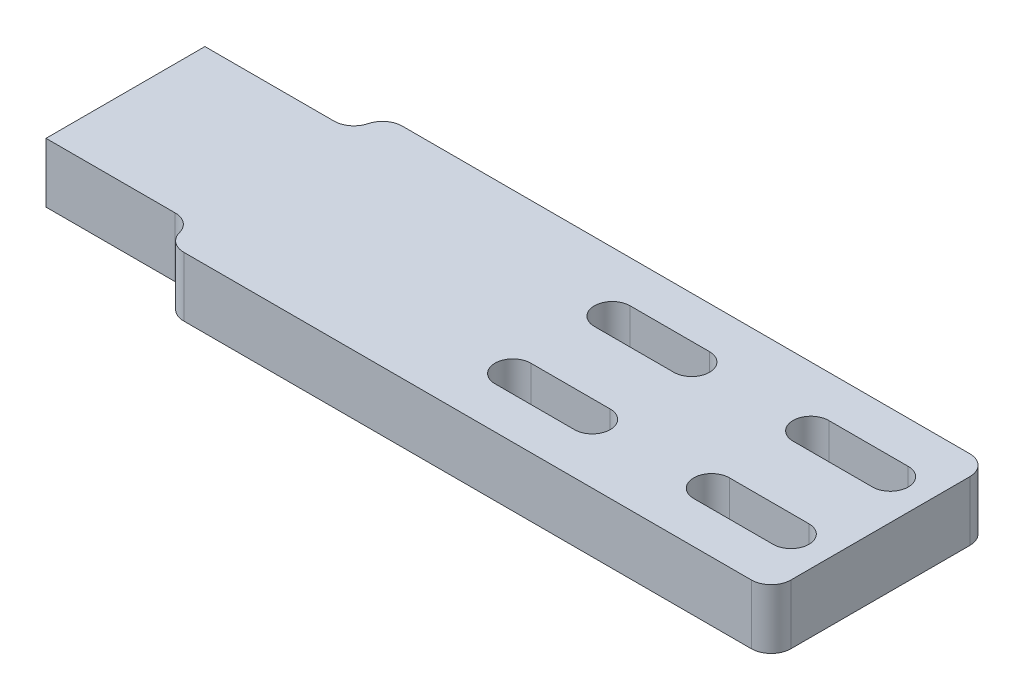
ISO-10303-21;
HEADER;
FILE_DESCRIPTION(('STEP AP214'),'2;1');
FILE_NAME('part.step','',(''),(''),'','','');
FILE_SCHEMA(('AUTOMOTIVE_DESIGN { 1 0 10303 214 1 1 1 1 }'));
ENDSEC;
DATA;
#1=APPLICATION_CONTEXT('core data for automotive mechanical design processes');
#2=APPLICATION_PROTOCOL_DEFINITION('international standard','automotive_design',2000,#1);
#3=PRODUCT_CONTEXT('',#1,'mechanical');
#4=PRODUCT('Part','Part','',(#3));
#5=PRODUCT_RELATED_PRODUCT_CATEGORY('part','',(#4));
#6=PRODUCT_DEFINITION_FORMATION('','',#4);
#7=PRODUCT_DEFINITION_CONTEXT('part definition',#1,'design');
#8=PRODUCT_DEFINITION('design','',#6,#7);
#9=PRODUCT_DEFINITION_SHAPE('','',#8);
#10=(LENGTH_UNIT() NAMED_UNIT(*) SI_UNIT(.MILLI.,.METRE.));
#11=(NAMED_UNIT(*) PLANE_ANGLE_UNIT() SI_UNIT($,.RADIAN.));
#12=(NAMED_UNIT(*) SI_UNIT($,.STERADIAN.) SOLID_ANGLE_UNIT());
#13=UNCERTAINTY_MEASURE_WITH_UNIT(LENGTH_MEASURE(1.E-05),#10,'distance_accuracy_value','');
#14=(GEOMETRIC_REPRESENTATION_CONTEXT(3) GLOBAL_UNCERTAINTY_ASSIGNED_CONTEXT((#13)) GLOBAL_UNIT_ASSIGNED_CONTEXT((#10,
#11,#12)) REPRESENTATION_CONTEXT('',''));
#15=CARTESIAN_POINT('',(0.,0.,0.));
#16=DIRECTION('',(0.,0.,1.));
#17=DIRECTION('',(1.,0.,0.));
#18=AXIS2_PLACEMENT_3D('',#15,#16,#17);
#19=CARTESIAN_POINT('',(0.,6.,0.));
#20=DIRECTION('',(0.,1.,0.));
#21=DIRECTION('',(0.,0.,1.));
#22=AXIS2_PLACEMENT_3D('',#19,#20,#21);
#23=PLANE('',#22);
#24=DIRECTION('',(-1.,0.,0.));
#25=VECTOR('',#24,1.);
#26=CARTESIAN_POINT('',(34.,6.,-6.80000000000001));
#27=LINE('',#26,#25);
#28=CARTESIAN_POINT('',(34.,6.,-6.80000000000001));
#29=VERTEX_POINT('',#28);
#30=CARTESIAN_POINT('',(26.,6.,-6.79999999999999));
#31=VERTEX_POINT('',#30);
#32=EDGE_CURVE('E937',#29,#31,#27,.T.);
#33=ORIENTED_EDGE('',*,*,#32,.F.);
#34=CARTESIAN_POINT('',(34.,6.,-5.00000000000002));
#35=DIRECTION('',(0.,-1.,0.));
#36=DIRECTION('',(0.,0.,-1.));
#37=AXIS2_PLACEMENT_3D('',#34,#35,#36);
#38=CIRCLE('',#37,1.8);
#39=CARTESIAN_POINT('',(34.,6.,-3.20000000000002));
#40=VERTEX_POINT('',#39);
#41=EDGE_CURVE('E944',#29,#40,#38,.T.);
#42=ORIENTED_EDGE('',*,*,#41,.T.);
#43=DIRECTION('',(-1.,0.,0.));
#44=VECTOR('',#43,1.);
#45=CARTESIAN_POINT('',(34.,6.,-3.20000000000002));
#46=LINE('',#45,#44);
#47=CARTESIAN_POINT('',(26.,6.,-3.2));
#48=VERTEX_POINT('',#47);
#49=EDGE_CURVE('E934',#40,#48,#46,.T.);
#50=ORIENTED_EDGE('',*,*,#49,.T.);
#51=CARTESIAN_POINT('',(26.,6.,-4.99999999999999));
#52=DIRECTION('',(0.,-1.,0.));
#53=DIRECTION('',(0.,0.,-1.));
#54=AXIS2_PLACEMENT_3D('',#51,#52,#53);
#55=CIRCLE('',#54,1.8);
#56=EDGE_CURVE('E955',#48,#31,#55,.T.);
#57=ORIENTED_EDGE('',*,*,#56,.T.);
#58=EDGE_LOOP('',(#33,#42,#50,#57));
#59=FACE_BOUND('',#58,.T.);
#60=CARTESIAN_POINT('',(26.,6.,5.00000000000001));
#61=DIRECTION('',(0.,-1.,0.));
#62=DIRECTION('',(0.,0.,-1.));
#63=AXIS2_PLACEMENT_3D('',#60,#61,#62);
#64=CIRCLE('',#63,1.8);
#65=CARTESIAN_POINT('',(26.,6.,6.80000000000001));
#66=VERTEX_POINT('',#65);
#67=CARTESIAN_POINT('',(26.,6.,3.20000000000001));
#68=VERTEX_POINT('',#67);
#69=EDGE_CURVE('E985',#66,#68,#64,.T.);
#70=ORIENTED_EDGE('',*,*,#69,.T.);
#71=DIRECTION('',(-1.,0.,0.));
#72=VECTOR('',#71,1.);
#73=CARTESIAN_POINT('',(34.,6.,3.19999999999999));
#74=LINE('',#73,#72);
#75=CARTESIAN_POINT('',(34.,6.,3.19999999999999));
#76=VERTEX_POINT('',#75);
#77=EDGE_CURVE('E967',#76,#68,#74,.T.);
#78=ORIENTED_EDGE('',*,*,#77,.F.);
#79=CARTESIAN_POINT('',(34.,6.,4.99999999999999));
#80=DIRECTION('',(0.,-1.,0.));
#81=DIRECTION('',(0.,0.,-1.));
#82=AXIS2_PLACEMENT_3D('',#79,#80,#81);
#83=CIRCLE('',#82,1.8);
#84=CARTESIAN_POINT('',(34.,6.,6.79999999999998));
#85=VERTEX_POINT('',#84);
#86=EDGE_CURVE('E975',#76,#85,#83,.T.);
#87=ORIENTED_EDGE('',*,*,#86,.T.);
#88=DIRECTION('',(-1.,0.,0.));
#89=VECTOR('',#88,1.);
#90=CARTESIAN_POINT('',(34.,6.,6.79999999999998));
#91=LINE('',#90,#89);
#92=EDGE_CURVE('E964',#85,#66,#91,.T.);
#93=ORIENTED_EDGE('',*,*,#92,.T.);
#94=EDGE_LOOP('',(#70,#78,#87,#93));
#95=FACE_BOUND('',#94,.T.);
#96=DIRECTION('',(-1.,0.,0.));
#97=VECTOR('',#96,1.);
#98=CARTESIAN_POINT('',(14.,6.,-6.80000000000001));
#99=LINE('',#98,#97);
#100=CARTESIAN_POINT('',(14.,6.,-6.80000000000001));
#101=VERTEX_POINT('',#100);
#102=CARTESIAN_POINT('',(6.00000000000002,6.,-6.79999999999999));
#103=VERTEX_POINT('',#102);
#104=EDGE_CURVE('E1034',#101,#103,#99,.T.);
#105=ORIENTED_EDGE('',*,*,#104,.F.);
#106=CARTESIAN_POINT('',(14.,6.,-5.00000000000001));
#107=DIRECTION('',(0.,-1.,0.));
#108=DIRECTION('',(0.,0.,-1.));
#109=AXIS2_PLACEMENT_3D('',#106,#107,#108);
#110=CIRCLE('',#109,1.8);
#111=CARTESIAN_POINT('',(14.,6.,-3.20000000000001));
#112=VERTEX_POINT('',#111);
#113=EDGE_CURVE('E1043',#101,#112,#110,.T.);
#114=ORIENTED_EDGE('',*,*,#113,.T.);
#115=DIRECTION('',(-1.,0.,0.));
#116=VECTOR('',#115,1.);
#117=CARTESIAN_POINT('',(14.,6.,-3.20000000000001));
#118=LINE('',#117,#116);
#119=CARTESIAN_POINT('',(6.00000000000003,6.,-3.19999999999999));
#120=VERTEX_POINT('',#119);
#121=EDGE_CURVE('E1030',#112,#120,#118,.T.);
#122=ORIENTED_EDGE('',*,*,#121,.T.);
#123=CARTESIAN_POINT('',(6.00000000000003,6.,-4.99999999999999));
#124=DIRECTION('',(0.,-1.,0.));
#125=DIRECTION('',(0.,0.,-1.));
#126=AXIS2_PLACEMENT_3D('',#123,#124,#125);
#127=CIRCLE('',#126,1.8);
#128=EDGE_CURVE('E1054',#120,#103,#127,.T.);
#129=ORIENTED_EDGE('',*,*,#128,.T.);
#130=EDGE_LOOP('',(#105,#114,#122,#129));
#131=FACE_BOUND('',#130,.T.);
#132=CARTESIAN_POINT('',(-25.,6.,10.));
#133=DIRECTION('',(0.,1.,0.));
#134=DIRECTION('',(0.,0.,1.));
#135=AXIS2_PLACEMENT_3D('',#132,#133,#134);
#136=CIRCLE('',#135,2.);
#137=CARTESIAN_POINT('',(-25.,6.,8.));
#138=VERTEX_POINT('',#137);
#139=CARTESIAN_POINT('',(-23.0635083268963,6.,9.5));
#140=VERTEX_POINT('',#139);
#141=EDGE_CURVE('E1069',#138,#140,#136,.F.);
#142=ORIENTED_EDGE('',*,*,#141,.T.);
#143=CARTESIAN_POINT('',(-21.1270166537926,6.,9.00000000000001));
#144=DIRECTION('',(0.,1.,0.));
#145=DIRECTION('',(0.,0.,1.));
#146=AXIS2_PLACEMENT_3D('',#143,#144,#145);
#147=CIRCLE('',#146,2.);
#148=CARTESIAN_POINT('',(-21.1270166537926,6.,11.));
#149=VERTEX_POINT('',#148);
#150=EDGE_CURVE('E1152',#140,#149,#147,.T.);
#151=ORIENTED_EDGE('',*,*,#150,.T.);
#152=DIRECTION('',(1.,0.,0.));
#153=VECTOR('',#152,1.);
#154=CARTESIAN_POINT('',(0.,6.,11.));
#155=LINE('',#154,#153);
#156=CARTESIAN_POINT('',(36.,6.,11.));
#157=VERTEX_POINT('',#156);
#158=EDGE_CURVE('E1073',#149,#157,#155,.T.);
#159=ORIENTED_EDGE('',*,*,#158,.T.);
#160=CARTESIAN_POINT('',(36.,6.,8.99999999999998));
#161=DIRECTION('',(0.,1.,0.));
#162=DIRECTION('',(0.,0.,1.));
#163=AXIS2_PLACEMENT_3D('',#160,#161,#162);
#164=CIRCLE('',#163,2.00000000000001);
#165=CARTESIAN_POINT('',(38.,6.,8.99999999999998));
#166=VERTEX_POINT('',#165);
#167=EDGE_CURVE('E1076',#166,#157,#164,.F.);
#168=ORIENTED_EDGE('',*,*,#167,.F.);
#169=DIRECTION('',(0.,0.,1.));
#170=VECTOR('',#169,1.);
#171=CARTESIAN_POINT('',(38.,6.,0.));
#172=LINE('',#171,#170);
#173=CARTESIAN_POINT('',(38.,6.,-8.99999999999999));
#174=VERTEX_POINT('',#173);
#175=EDGE_CURVE('E1080',#174,#166,#172,.T.);
#176=ORIENTED_EDGE('',*,*,#175,.F.);
#177=CARTESIAN_POINT('',(36.,6.,-8.99999999999999));
#178=DIRECTION('',(0.,1.,0.));
#179=DIRECTION('',(0.,0.,1.));
#180=AXIS2_PLACEMENT_3D('',#177,#178,#179);
#181=CIRCLE('',#180,2.00000000000001);
#182=CARTESIAN_POINT('',(36.,6.,-11.));
#183=VERTEX_POINT('',#182);
#184=EDGE_CURVE('E1083',#183,#174,#181,.F.);
#185=ORIENTED_EDGE('',*,*,#184,.F.);
#186=DIRECTION('',(1.,0.,0.));
#187=VECTOR('',#186,1.);
#188=CARTESIAN_POINT('',(0.,6.,-11.));
#189=LINE('',#188,#187);
#190=CARTESIAN_POINT('',(-21.1270166537926,6.,-11.));
#191=VERTEX_POINT('',#190);
#192=EDGE_CURVE('E1086',#191,#183,#189,.T.);
#193=ORIENTED_EDGE('',*,*,#192,.F.);
#194=CARTESIAN_POINT('',(-21.1270166537926,6.,-9.));
#195=DIRECTION('',(0.,1.,0.));
#196=DIRECTION('',(0.,0.,1.));
#197=AXIS2_PLACEMENT_3D('',#194,#195,#196);
#198=CIRCLE('',#197,2.);
#199=CARTESIAN_POINT('',(-23.0635083268963,6.,-9.5));
#200=VERTEX_POINT('',#199);
#201=EDGE_CURVE('E732',#191,#200,#198,.T.);
#202=ORIENTED_EDGE('',*,*,#201,.T.);
#203=CARTESIAN_POINT('',(-25.,6.,-9.99999999999999));
#204=DIRECTION('',(0.,1.,0.));
#205=DIRECTION('',(0.,0.,1.));
#206=AXIS2_PLACEMENT_3D('',#203,#204,#205);
#207=CIRCLE('',#206,2.);
#208=CARTESIAN_POINT('',(-25.,6.,-7.99999999999999));
#209=VERTEX_POINT('',#208);
#210=EDGE_CURVE('E1088',#209,#200,#207,.T.);
#211=ORIENTED_EDGE('',*,*,#210,.F.);
#212=DIRECTION('',(1.,0.,0.));
#213=VECTOR('',#212,1.);
#214=CARTESIAN_POINT('',(0.,6.,-7.99999999999999));
#215=LINE('',#214,#213);
#216=CARTESIAN_POINT('',(-38.,6.,-7.99999999999999));
#217=VERTEX_POINT('',#216);
#218=EDGE_CURVE('E1090',#217,#209,#215,.T.);
#219=ORIENTED_EDGE('',*,*,#218,.F.);
#220=DIRECTION('',(0.,0.,1.));
#221=VECTOR('',#220,1.);
#222=CARTESIAN_POINT('',(-38.,6.,0.));
#223=LINE('',#222,#221);
#224=CARTESIAN_POINT('',(-38.,6.,8.));
#225=VERTEX_POINT('',#224);
#226=EDGE_CURVE('E1093',#217,#225,#223,.T.);
#227=ORIENTED_EDGE('',*,*,#226,.T.);
#228=DIRECTION('',(1.,0.,0.));
#229=VECTOR('',#228,1.);
#230=CARTESIAN_POINT('',(0.,6.,7.99999999999999));
#231=LINE('',#230,#229);
#232=EDGE_CURVE('E1066',#225,#138,#231,.T.);
#233=ORIENTED_EDGE('',*,*,#232,.T.);
#234=EDGE_LOOP('',(#142,#151,#159,#168,#176,#185,#193,#202,#211,#219,#227,#233));
#235=FACE_BOUND('',#234,.T.);
#236=CARTESIAN_POINT('',(14.,6.,4.99999999999999));
#237=DIRECTION('',(0.,-1.,0.));
#238=DIRECTION('',(0.,0.,-1.));
#239=AXIS2_PLACEMENT_3D('',#236,#237,#238);
#240=CIRCLE('',#239,1.8);
#241=CARTESIAN_POINT('',(14.,6.,3.19999999999999));
#242=VERTEX_POINT('',#241);
#243=CARTESIAN_POINT('',(14.,6.,6.79999999999999));
#244=VERTEX_POINT('',#243);
#245=EDGE_CURVE('E1005',#242,#244,#240,.T.);
#246=ORIENTED_EDGE('',*,*,#245,.T.);
#247=DIRECTION('',(-1.,0.,0.));
#248=VECTOR('',#247,1.);
#249=CARTESIAN_POINT('',(14.,6.,6.79999999999999));
#250=LINE('',#249,#248);
#251=CARTESIAN_POINT('',(6.00000000000003,6.,6.80000000000001));
#252=VERTEX_POINT('',#251);
#253=EDGE_CURVE('E994',#244,#252,#250,.T.);
#254=ORIENTED_EDGE('',*,*,#253,.T.);
#255=CARTESIAN_POINT('',(6.00000000000003,6.,5.00000000000001));
#256=DIRECTION('',(0.,-1.,0.));
#257=DIRECTION('',(0.,0.,-1.));
#258=AXIS2_PLACEMENT_3D('',#255,#256,#257);
#259=CIRCLE('',#258,1.8);
#260=CARTESIAN_POINT('',(6.00000000000002,6.,3.20000000000001));
#261=VERTEX_POINT('',#260);
#262=EDGE_CURVE('E1018',#252,#261,#259,.T.);
#263=ORIENTED_EDGE('',*,*,#262,.T.);
#264=DIRECTION('',(-1.,0.,0.));
#265=VECTOR('',#264,1.);
#266=CARTESIAN_POINT('',(14.,6.,3.19999999999999));
#267=LINE('',#266,#265);
#268=EDGE_CURVE('E997',#242,#261,#267,.T.);
#269=ORIENTED_EDGE('',*,*,#268,.F.);
#270=EDGE_LOOP('',(#246,#254,#263,#269));
#271=FACE_BOUND('',#270,.T.);
#272=ADVANCED_FACE('F717',(#59,#95,#131,#235,#271),#23,.T.);
#273=CARTESIAN_POINT('',(0.,6.,7.99999999999999));
#274=DIRECTION('',(0.,0.,-1.));
#275=DIRECTION('',(-1.,0.,0.));
#276=AXIS2_PLACEMENT_3D('',#273,#274,#275);
#277=PLANE('',#276);
#278=DIRECTION('',(1.,0.,0.));
#279=VECTOR('',#278,1.);
#280=CARTESIAN_POINT('',(0.,0.,7.99999999999999));
#281=LINE('',#280,#279);
#282=CARTESIAN_POINT('',(-38.,0.,8.));
#283=VERTEX_POINT('',#282);
#284=CARTESIAN_POINT('',(-25.,0.,8.));
#285=VERTEX_POINT('',#284);
#286=EDGE_CURVE('E1065',#283,#285,#281,.T.);
#287=ORIENTED_EDGE('',*,*,#286,.T.);
#288=DIRECTION('',(0.,-1.,0.));
#289=VECTOR('',#288,1.);
#290=CARTESIAN_POINT('',(-25.,6.,8.));
#291=LINE('',#290,#289);
#292=EDGE_CURVE('E1139',#138,#285,#291,.T.);
#293=ORIENTED_EDGE('',*,*,#292,.F.);
#294=ORIENTED_EDGE('',*,*,#232,.F.);
#295=DIRECTION('',(0.,-1.,0.));
#296=VECTOR('',#295,1.);
#297=CARTESIAN_POINT('',(-38.,6.,8.));
#298=LINE('',#297,#296);
#299=EDGE_CURVE('E1095',#225,#283,#298,.T.);
#300=ORIENTED_EDGE('',*,*,#299,.T.);
#301=EDGE_LOOP('',(#287,#293,#294,#300));
#302=FACE_BOUND('',#301,.T.);
#303=ADVANCED_FACE('F1176',(#302),#277,.F.);
#304=CARTESIAN_POINT('',(-25.,6.,10.));
#305=DIRECTION('',(0.,-1.,0.));
#306=DIRECTION('',(0.,0.,-1.));
#307=AXIS2_PLACEMENT_3D('',#304,#305,#306);
#308=CYLINDRICAL_SURFACE('',#307,2.);
#309=CARTESIAN_POINT('',(-25.,0.,10.));
#310=DIRECTION('',(0.,1.,0.));
#311=DIRECTION('',(0.,0.,1.));
#312=AXIS2_PLACEMENT_3D('',#309,#310,#311);
#313=CIRCLE('',#312,2.);
#314=CARTESIAN_POINT('',(-23.0635083268963,0.,9.5));
#315=VERTEX_POINT('',#314);
#316=EDGE_CURVE('E1098',#285,#315,#313,.F.);
#317=ORIENTED_EDGE('',*,*,#316,.T.);
#318=DIRECTION('',(0.,-1.,0.));
#319=VECTOR('',#318,1.);
#320=CARTESIAN_POINT('',(-23.0635083268963,6.,9.5));
#321=LINE('',#320,#319);
#322=EDGE_CURVE('E1149',#315,#140,#321,.F.);
#323=ORIENTED_EDGE('',*,*,#322,.T.);
#324=ORIENTED_EDGE('',*,*,#141,.F.);
#325=ORIENTED_EDGE('',*,*,#292,.T.);
#326=EDGE_LOOP('',(#317,#323,#324,#325));
#327=FACE_BOUND('',#326,.T.);
#328=ADVANCED_FACE('F1178',(#327),#308,.F.);
#329=CARTESIAN_POINT('',(0.,6.,11.));
#330=DIRECTION('',(0.,0.,-1.));
#331=DIRECTION('',(-1.,0.,0.));
#332=AXIS2_PLACEMENT_3D('',#329,#330,#331);
#333=PLANE('',#332);
#334=ORIENTED_EDGE('',*,*,#158,.F.);
#335=DIRECTION('',(0.,-1.,0.));
#336=VECTOR('',#335,1.);
#337=CARTESIAN_POINT('',(-21.1270166537926,6.,11.));
#338=LINE('',#337,#336);
#339=CARTESIAN_POINT('',(-21.1270166537926,0.,11.));
#340=VERTEX_POINT('',#339);
#341=EDGE_CURVE('E1142',#149,#340,#338,.T.);
#342=ORIENTED_EDGE('',*,*,#341,.T.);
#343=DIRECTION('',(1.,0.,0.));
#344=VECTOR('',#343,1.);
#345=CARTESIAN_POINT('',(0.,0.,11.));
#346=LINE('',#345,#344);
#347=CARTESIAN_POINT('',(36.,0.,11.));
#348=VERTEX_POINT('',#347);
#349=EDGE_CURVE('E1101',#340,#348,#346,.T.);
#350=ORIENTED_EDGE('',*,*,#349,.T.);
#351=DIRECTION('',(0.,-1.,0.));
#352=VECTOR('',#351,1.);
#353=CARTESIAN_POINT('',(36.,6.,11.));
#354=LINE('',#353,#352);
#355=EDGE_CURVE('E1135',#157,#348,#354,.T.);
#356=ORIENTED_EDGE('',*,*,#355,.F.);
#357=EDGE_LOOP('',(#334,#342,#350,#356));
#358=FACE_BOUND('',#357,.T.);
#359=ADVANCED_FACE('F1186',(#358),#333,.F.);
#360=CARTESIAN_POINT('',(36.,6.,8.99999999999998));
#361=DIRECTION('',(0.,-1.,0.));
#362=DIRECTION('',(0.,0.,-1.));
#363=AXIS2_PLACEMENT_3D('',#360,#361,#362);
#364=CYLINDRICAL_SURFACE('',#363,2.00000000000001);
#365=CARTESIAN_POINT('',(36.,0.,8.99999999999998));
#366=DIRECTION('',(0.,1.,0.));
#367=DIRECTION('',(0.,0.,1.));
#368=AXIS2_PLACEMENT_3D('',#365,#366,#367);
#369=CIRCLE('',#368,2.00000000000001);
#370=CARTESIAN_POINT('',(38.,0.,8.99999999999998));
#371=VERTEX_POINT('',#370);
#372=EDGE_CURVE('E1104',#371,#348,#369,.F.);
#373=ORIENTED_EDGE('',*,*,#372,.F.);
#374=DIRECTION('',(0.,-1.,0.));
#375=VECTOR('',#374,1.);
#376=CARTESIAN_POINT('',(38.,6.,8.99999999999998));
#377=LINE('',#376,#375);
#378=EDGE_CURVE('E1133',#166,#371,#377,.T.);
#379=ORIENTED_EDGE('',*,*,#378,.F.);
#380=ORIENTED_EDGE('',*,*,#167,.T.);
#381=ORIENTED_EDGE('',*,*,#355,.T.);
#382=EDGE_LOOP('',(#373,#379,#380,#381));
#383=FACE_BOUND('',#382,.T.);
#384=ADVANCED_FACE('F1191',(#383),#364,.T.);
#385=CARTESIAN_POINT('',(38.,6.,0.));
#386=DIRECTION('',(1.,0.,0.));
#387=DIRECTION('',(0.,0.,-1.));
#388=AXIS2_PLACEMENT_3D('',#385,#386,#387);
#389=PLANE('',#388);
#390=DIRECTION('',(0.,0.,1.));
#391=VECTOR('',#390,1.);
#392=CARTESIAN_POINT('',(38.,0.,0.));
#393=LINE('',#392,#391);
#394=CARTESIAN_POINT('',(38.,0.,-8.99999999999999));
#395=VERTEX_POINT('',#394);
#396=EDGE_CURVE('E1107',#395,#371,#393,.T.);
#397=ORIENTED_EDGE('',*,*,#396,.F.);
#398=DIRECTION('',(0.,-1.,0.));
#399=VECTOR('',#398,1.);
#400=CARTESIAN_POINT('',(38.,6.,-8.99999999999999));
#401=LINE('',#400,#399);
#402=EDGE_CURVE('E1131',#174,#395,#401,.T.);
#403=ORIENTED_EDGE('',*,*,#402,.F.);
#404=ORIENTED_EDGE('',*,*,#175,.T.);
#405=ORIENTED_EDGE('',*,*,#378,.T.);
#406=EDGE_LOOP('',(#397,#403,#404,#405));
#407=FACE_BOUND('',#406,.T.);
#408=ADVANCED_FACE('F1196',(#407),#389,.T.);
#409=CARTESIAN_POINT('',(36.,6.,-8.99999999999999));
#410=DIRECTION('',(0.,-1.,0.));
#411=DIRECTION('',(0.,0.,-1.));
#412=AXIS2_PLACEMENT_3D('',#409,#410,#411);
#413=CYLINDRICAL_SURFACE('',#412,2.00000000000001);
#414=CARTESIAN_POINT('',(36.,0.,-8.99999999999999));
#415=DIRECTION('',(0.,1.,0.));
#416=DIRECTION('',(0.,0.,1.));
#417=AXIS2_PLACEMENT_3D('',#414,#415,#416);
#418=CIRCLE('',#417,2.00000000000001);
#419=CARTESIAN_POINT('',(36.,0.,-11.));
#420=VERTEX_POINT('',#419);
#421=EDGE_CURVE('E1110',#420,#395,#418,.F.);
#422=ORIENTED_EDGE('',*,*,#421,.F.);
#423=DIRECTION('',(0.,-1.,0.));
#424=VECTOR('',#423,1.);
#425=CARTESIAN_POINT('',(36.,6.,-11.));
#426=LINE('',#425,#424);
#427=EDGE_CURVE('E1128',#183,#420,#426,.T.);
#428=ORIENTED_EDGE('',*,*,#427,.F.);
#429=ORIENTED_EDGE('',*,*,#184,.T.);
#430=ORIENTED_EDGE('',*,*,#402,.T.);
#431=EDGE_LOOP('',(#422,#428,#429,#430));
#432=FACE_BOUND('',#431,.T.);
#433=ADVANCED_FACE('F1199',(#432),#413,.T.);
#434=CARTESIAN_POINT('',(0.,6.,-11.));
#435=DIRECTION('',(0.,0.,-1.));
#436=DIRECTION('',(-1.,0.,0.));
#437=AXIS2_PLACEMENT_3D('',#434,#435,#436);
#438=PLANE('',#437);
#439=DIRECTION('',(1.,0.,0.));
#440=VECTOR('',#439,1.);
#441=CARTESIAN_POINT('',(0.,0.,-11.));
#442=LINE('',#441,#440);
#443=CARTESIAN_POINT('',(-21.1270166537926,0.,-11.));
#444=VERTEX_POINT('',#443);
#445=EDGE_CURVE('E1113',#444,#420,#442,.T.);
#446=ORIENTED_EDGE('',*,*,#445,.F.);
#447=DIRECTION('',(0.,-1.,0.));
#448=VECTOR('',#447,1.);
#449=CARTESIAN_POINT('',(-21.1270166537926,6.,-11.));
#450=LINE('',#449,#448);
#451=EDGE_CURVE('E13',#444,#191,#450,.F.);
#452=ORIENTED_EDGE('',*,*,#451,.T.);
#453=ORIENTED_EDGE('',*,*,#192,.T.);
#454=ORIENTED_EDGE('',*,*,#427,.T.);
#455=EDGE_LOOP('',(#446,#452,#453,#454));
#456=FACE_BOUND('',#455,.T.);
#457=ADVANCED_FACE('F1227',(#456),#438,.T.);
#458=CARTESIAN_POINT('',(-25.,6.,-9.99999999999999));
#459=DIRECTION('',(0.,-1.,0.));
#460=DIRECTION('',(0.,0.,-1.));
#461=AXIS2_PLACEMENT_3D('',#458,#459,#460);
#462=CYLINDRICAL_SURFACE('',#461,2.);
#463=ORIENTED_EDGE('',*,*,#210,.T.);
#464=DIRECTION('',(0.,-1.,0.));
#465=VECTOR('',#464,1.);
#466=CARTESIAN_POINT('',(-23.0635083268963,6.,-9.5));
#467=LINE('',#466,#465);
#468=CARTESIAN_POINT('',(-23.0635083268963,0.,-9.5));
#469=VERTEX_POINT('',#468);
#470=EDGE_CURVE('E725',#200,#469,#467,.T.);
#471=ORIENTED_EDGE('',*,*,#470,.T.);
#472=CARTESIAN_POINT('',(-25.,0.,-9.99999999999999));
#473=DIRECTION('',(0.,1.,0.));
#474=DIRECTION('',(0.,0.,1.));
#475=AXIS2_PLACEMENT_3D('',#472,#473,#474);
#476=CIRCLE('',#475,2.);
#477=CARTESIAN_POINT('',(-25.,0.,-7.99999999999999));
#478=VERTEX_POINT('',#477);
#479=EDGE_CURVE('E1115',#478,#469,#476,.T.);
#480=ORIENTED_EDGE('',*,*,#479,.F.);
#481=DIRECTION('',(0.,-1.,0.));
#482=VECTOR('',#481,1.);
#483=CARTESIAN_POINT('',(-25.,6.,-7.99999999999999));
#484=LINE('',#483,#482);
#485=EDGE_CURVE('E1126',#209,#478,#484,.T.);
#486=ORIENTED_EDGE('',*,*,#485,.F.);
#487=EDGE_LOOP('',(#463,#471,#480,#486));
#488=FACE_BOUND('',#487,.T.);
#489=ADVANCED_FACE('F1157',(#488),#462,.F.);
#490=CARTESIAN_POINT('',(0.,6.,-7.99999999999999));
#491=DIRECTION('',(0.,0.,-1.));
#492=DIRECTION('',(-1.,0.,0.));
#493=AXIS2_PLACEMENT_3D('',#490,#491,#492);
#494=PLANE('',#493);
#495=DIRECTION('',(1.,0.,0.));
#496=VECTOR('',#495,1.);
#497=CARTESIAN_POINT('',(0.,0.,-7.99999999999999));
#498=LINE('',#497,#496);
#499=CARTESIAN_POINT('',(-38.,0.,-7.99999999999999));
#500=VERTEX_POINT('',#499);
#501=EDGE_CURVE('E1118',#500,#478,#498,.T.);
#502=ORIENTED_EDGE('',*,*,#501,.F.);
#503=DIRECTION('',(0.,-1.,0.));
#504=VECTOR('',#503,1.);
#505=CARTESIAN_POINT('',(-38.,6.,-7.99999999999999));
#506=LINE('',#505,#504);
#507=EDGE_CURVE('E1124',#217,#500,#506,.T.);
#508=ORIENTED_EDGE('',*,*,#507,.F.);
#509=ORIENTED_EDGE('',*,*,#218,.T.);
#510=ORIENTED_EDGE('',*,*,#485,.T.);
#511=EDGE_LOOP('',(#502,#508,#509,#510));
#512=FACE_BOUND('',#511,.T.);
#513=ADVANCED_FACE('F1166',(#512),#494,.T.);
#514=CARTESIAN_POINT('',(-38.,6.,0.));
#515=DIRECTION('',(1.,0.,0.));
#516=DIRECTION('',(0.,0.,-1.));
#517=AXIS2_PLACEMENT_3D('',#514,#515,#516);
#518=PLANE('',#517);
#519=CARTESIAN_POINT('',(-38.,2.93478260869565,-5.));
#520=DIRECTION('',(-1.,0.,0.));
#521=DIRECTION('',(0.,0.,1.));
#522=AXIS2_PLACEMENT_3D('',#519,#520,#521);
#523=CIRCLE('',#522,1.24999999999999);
#524=CARTESIAN_POINT('',(-38.,2.93478260869565,-3.75000000000001));
#525=VERTEX_POINT('',#524);
#526=EDGE_CURVE('E922',#525,#525,#523,.T.);
#527=ORIENTED_EDGE('',*,*,#526,.F.);
#528=EDGE_LOOP('',(#527));
#529=FACE_BOUND('',#528,.T.);
#530=CARTESIAN_POINT('',(-38.,2.93478260869565,5.));
#531=DIRECTION('',(-1.,0.,0.));
#532=DIRECTION('',(0.,0.,1.));
#533=AXIS2_PLACEMENT_3D('',#530,#531,#532);
#534=CIRCLE('',#533,1.24999999999999);
#535=CARTESIAN_POINT('',(-38.,2.93478260869565,6.24999999999999));
#536=VERTEX_POINT('',#535);
#537=EDGE_CURVE('E921',#536,#536,#534,.T.);
#538=ORIENTED_EDGE('',*,*,#537,.F.);
#539=EDGE_LOOP('',(#538));
#540=FACE_BOUND('',#539,.T.);
#541=DIRECTION('',(0.,0.,1.));
#542=VECTOR('',#541,1.);
#543=CARTESIAN_POINT('',(-38.,0.,0.));
#544=LINE('',#543,#542);
#545=EDGE_CURVE('E1070',#500,#283,#544,.T.);
#546=ORIENTED_EDGE('',*,*,#545,.T.);
#547=ORIENTED_EDGE('',*,*,#299,.F.);
#548=ORIENTED_EDGE('',*,*,#226,.F.);
#549=ORIENTED_EDGE('',*,*,#507,.T.);
#550=EDGE_LOOP('',(#546,#547,#548,#549));
#551=FACE_BOUND('',#550,.T.);
#552=ADVANCED_FACE('F1174',(#529,#540,#551),#518,.F.);
#553=CARTESIAN_POINT('',(0.,0.,0.));
#554=DIRECTION('',(0.,1.,0.));
#555=DIRECTION('',(0.,0.,1.));
#556=AXIS2_PLACEMENT_3D('',#553,#554,#555);
#557=PLANE('',#556);
#558=CARTESIAN_POINT('',(34.,0.,-5.00000000000002));
#559=DIRECTION('',(0.,-1.,0.));
#560=DIRECTION('',(0.,0.,-1.));
#561=AXIS2_PLACEMENT_3D('',#558,#559,#560);
#562=CIRCLE('',#561,1.8);
#563=CARTESIAN_POINT('',(34.,0.,-6.80000000000001));
#564=VERTEX_POINT('',#563);
#565=CARTESIAN_POINT('',(34.,0.,-3.20000000000002));
#566=VERTEX_POINT('',#565);
#567=EDGE_CURVE('E942',#564,#566,#562,.T.);
#568=ORIENTED_EDGE('',*,*,#567,.F.);
#569=DIRECTION('',(-1.,0.,0.));
#570=VECTOR('',#569,1.);
#571=CARTESIAN_POINT('',(34.,0.,-6.80000000000001));
#572=LINE('',#571,#570);
#573=CARTESIAN_POINT('',(26.,0.,-6.79999999999999));
#574=VERTEX_POINT('',#573);
#575=EDGE_CURVE('E939',#564,#574,#572,.T.);
#576=ORIENTED_EDGE('',*,*,#575,.T.);
#577=CARTESIAN_POINT('',(26.,0.,-4.99999999999999));
#578=DIRECTION('',(0.,-1.,0.));
#579=DIRECTION('',(0.,0.,-1.));
#580=AXIS2_PLACEMENT_3D('',#577,#578,#579);
#581=CIRCLE('',#580,1.8);
#582=CARTESIAN_POINT('',(26.,0.,-3.20000000000001));
#583=VERTEX_POINT('',#582);
#584=EDGE_CURVE('E952',#583,#574,#581,.T.);
#585=ORIENTED_EDGE('',*,*,#584,.F.);
#586=DIRECTION('',(-1.,0.,0.));
#587=VECTOR('',#586,1.);
#588=CARTESIAN_POINT('',(34.,0.,-3.20000000000003));
#589=LINE('',#588,#587);
#590=EDGE_CURVE('E932',#566,#583,#589,.T.);
#591=ORIENTED_EDGE('',*,*,#590,.F.);
#592=EDGE_LOOP('',(#568,#576,#585,#591));
#593=FACE_BOUND('',#592,.T.);
#594=CARTESIAN_POINT('',(34.,0.,4.99999999999999));
#595=DIRECTION('',(0.,-1.,0.));
#596=DIRECTION('',(0.,0.,-1.));
#597=AXIS2_PLACEMENT_3D('',#594,#595,#596);
#598=CIRCLE('',#597,1.8);
#599=CARTESIAN_POINT('',(34.,0.,3.19999999999999));
#600=VERTEX_POINT('',#599);
#601=CARTESIAN_POINT('',(34.,0.,6.79999999999998));
#602=VERTEX_POINT('',#601);
#603=EDGE_CURVE('E972',#600,#602,#598,.T.);
#604=ORIENTED_EDGE('',*,*,#603,.F.);
#605=DIRECTION('',(-1.,0.,0.));
#606=VECTOR('',#605,1.);
#607=CARTESIAN_POINT('',(34.,0.,3.19999999999999));
#608=LINE('',#607,#606);
#609=CARTESIAN_POINT('',(26.,0.,3.20000000000001));
#610=VERTEX_POINT('',#609);
#611=EDGE_CURVE('E969',#600,#610,#608,.T.);
#612=ORIENTED_EDGE('',*,*,#611,.T.);
#613=CARTESIAN_POINT('',(26.,0.,5.00000000000001));
#614=DIRECTION('',(0.,-1.,0.));
#615=DIRECTION('',(0.,0.,-1.));
#616=AXIS2_PLACEMENT_3D('',#613,#614,#615);
#617=CIRCLE('',#616,1.8);
#618=CARTESIAN_POINT('',(26.,0.,6.8));
#619=VERTEX_POINT('',#618);
#620=EDGE_CURVE('E982',#619,#610,#617,.T.);
#621=ORIENTED_EDGE('',*,*,#620,.F.);
#622=DIRECTION('',(-1.,0.,0.));
#623=VECTOR('',#622,1.);
#624=CARTESIAN_POINT('',(34.,0.,6.79999999999998));
#625=LINE('',#624,#623);
#626=EDGE_CURVE('E962',#602,#619,#625,.T.);
#627=ORIENTED_EDGE('',*,*,#626,.F.);
#628=EDGE_LOOP('',(#604,#612,#621,#627));
#629=FACE_BOUND('',#628,.T.);
#630=CARTESIAN_POINT('',(14.,0.,4.99999999999999));
#631=DIRECTION('',(0.,-1.,0.));
#632=DIRECTION('',(0.,0.,-1.));
#633=AXIS2_PLACEMENT_3D('',#630,#631,#632);
#634=CIRCLE('',#633,1.8);
#635=CARTESIAN_POINT('',(14.,0.,3.19999999999999));
#636=VERTEX_POINT('',#635);
#637=CARTESIAN_POINT('',(14.,0.,6.79999999999999));
#638=VERTEX_POINT('',#637);
#639=EDGE_CURVE('E1003',#636,#638,#634,.T.);
#640=ORIENTED_EDGE('',*,*,#639,.F.);
#641=DIRECTION('',(-1.,0.,0.));
#642=VECTOR('',#641,1.);
#643=CARTESIAN_POINT('',(14.,0.,3.19999999999999));
#644=LINE('',#643,#642);
#645=CARTESIAN_POINT('',(6.00000000000002,0.,3.20000000000001));
#646=VERTEX_POINT('',#645);
#647=EDGE_CURVE('E999',#636,#646,#644,.T.);
#648=ORIENTED_EDGE('',*,*,#647,.T.);
#649=CARTESIAN_POINT('',(6.00000000000003,0.,5.00000000000001));
#650=DIRECTION('',(0.,-1.,0.));
#651=DIRECTION('',(0.,0.,-1.));
#652=AXIS2_PLACEMENT_3D('',#649,#650,#651);
#653=CIRCLE('',#652,1.8);
#654=CARTESIAN_POINT('',(6.00000000000003,0.,6.80000000000007));
#655=VERTEX_POINT('',#654);
#656=EDGE_CURVE('E1014',#655,#646,#653,.T.);
#657=ORIENTED_EDGE('',*,*,#656,.F.);
#658=DIRECTION('',(-1.,0.,0.));
#659=VECTOR('',#658,1.);
#660=CARTESIAN_POINT('',(14.,0.,6.80000000000005));
#661=LINE('',#660,#659);
#662=EDGE_CURVE('E992',#638,#655,#661,.T.);
#663=ORIENTED_EDGE('',*,*,#662,.F.);
#664=EDGE_LOOP('',(#640,#648,#657,#663));
#665=FACE_BOUND('',#664,.T.);
#666=CARTESIAN_POINT('',(14.,0.,-5.00000000000001));
#667=DIRECTION('',(0.,-1.,0.));
#668=DIRECTION('',(0.,0.,-1.));
#669=AXIS2_PLACEMENT_3D('',#666,#667,#668);
#670=CIRCLE('',#669,1.8);
#671=CARTESIAN_POINT('',(14.,0.,-6.80000000000001));
#672=VERTEX_POINT('',#671);
#673=CARTESIAN_POINT('',(14.,0.,-3.20000000000003));
#674=VERTEX_POINT('',#673);
#675=EDGE_CURVE('E1040',#672,#674,#670,.T.);
#676=ORIENTED_EDGE('',*,*,#675,.F.);
#677=DIRECTION('',(-1.,0.,0.));
#678=VECTOR('',#677,1.);
#679=CARTESIAN_POINT('',(14.,0.,-6.80000000000001));
#680=LINE('',#679,#678);
#681=CARTESIAN_POINT('',(6.00000000000002,0.,-6.79999999999999));
#682=VERTEX_POINT('',#681);
#683=EDGE_CURVE('E1037',#672,#682,#680,.T.);
#684=ORIENTED_EDGE('',*,*,#683,.T.);
#685=CARTESIAN_POINT('',(6.00000000000003,0.,-4.99999999999999));
#686=DIRECTION('',(0.,-1.,0.));
#687=DIRECTION('',(0.,0.,-1.));
#688=AXIS2_PLACEMENT_3D('',#685,#686,#687);
#689=CIRCLE('',#688,1.8);
#690=CARTESIAN_POINT('',(6.00000000000003,0.,-3.20000000000001));
#691=VERTEX_POINT('',#690);
#692=EDGE_CURVE('E1050',#691,#682,#689,.T.);
#693=ORIENTED_EDGE('',*,*,#692,.F.);
#694=DIRECTION('',(-1.,0.,0.));
#695=VECTOR('',#694,1.);
#696=CARTESIAN_POINT('',(14.,0.,-3.20000000000003));
#697=LINE('',#696,#695);
#698=EDGE_CURVE('E1026',#674,#691,#697,.T.);
#699=ORIENTED_EDGE('',*,*,#698,.F.);
#700=EDGE_LOOP('',(#676,#684,#693,#699));
#701=FACE_BOUND('',#700,.T.);
#702=ORIENTED_EDGE('',*,*,#349,.F.);
#703=CARTESIAN_POINT('',(-21.1270166537926,0.,9.00000000000001));
#704=DIRECTION('',(0.,1.,0.));
#705=DIRECTION('',(0.,0.,1.));
#706=AXIS2_PLACEMENT_3D('',#703,#704,#705);
#707=CIRCLE('',#706,2.);
#708=EDGE_CURVE('E1147',#340,#315,#707,.F.);
#709=ORIENTED_EDGE('',*,*,#708,.T.);
#710=ORIENTED_EDGE('',*,*,#316,.F.);
#711=ORIENTED_EDGE('',*,*,#286,.F.);
#712=ORIENTED_EDGE('',*,*,#545,.F.);
#713=ORIENTED_EDGE('',*,*,#501,.T.);
#714=ORIENTED_EDGE('',*,*,#479,.T.);
#715=CARTESIAN_POINT('',(-21.1270166537926,0.,-9.));
#716=DIRECTION('',(0.,1.,0.));
#717=DIRECTION('',(0.,0.,1.));
#718=AXIS2_PLACEMENT_3D('',#715,#716,#717);
#719=CIRCLE('',#718,2.);
#720=EDGE_CURVE('E1145',#469,#444,#719,.F.);
#721=ORIENTED_EDGE('',*,*,#720,.T.);
#722=ORIENTED_EDGE('',*,*,#445,.T.);
#723=ORIENTED_EDGE('',*,*,#421,.T.);
#724=ORIENTED_EDGE('',*,*,#396,.T.);
#725=ORIENTED_EDGE('',*,*,#372,.T.);
#726=EDGE_LOOP('',(#702,#709,#710,#711,#712,#713,#714,#721,#722,#723,#724,#725));
#727=FACE_BOUND('',#726,.T.);
#728=ADVANCED_FACE('F1161',(#593,#629,#665,#701,#727),#557,.F.);
#729=CARTESIAN_POINT('',(6.00000000000003,0.,-4.99999999999999));
#730=DIRECTION('',(0.,-1.,0.));
#731=DIRECTION('',(0.,0.,-1.));
#732=AXIS2_PLACEMENT_3D('',#729,#730,#731);
#733=CYLINDRICAL_SURFACE('',#732,1.8);
#734=ORIENTED_EDGE('',*,*,#692,.T.);
#735=DIRECTION('',(0.,-1.,0.));
#736=VECTOR('',#735,1.);
#737=CARTESIAN_POINT('',(6.00000000000002,0.,-6.79999999999999));
#738=LINE('',#737,#736);
#739=EDGE_CURVE('E1058',#103,#682,#738,.T.);
#740=ORIENTED_EDGE('',*,*,#739,.F.);
#741=ORIENTED_EDGE('',*,*,#128,.F.);
#742=DIRECTION('',(0.,-1.,0.));
#743=VECTOR('',#742,1.);
#744=CARTESIAN_POINT('',(6.00000000000003,0.,-3.19999999999999));
#745=LINE('',#744,#743);
#746=EDGE_CURVE('E1061',#691,#120,#745,.F.);
#747=ORIENTED_EDGE('',*,*,#746,.F.);
#748=EDGE_LOOP('',(#734,#740,#741,#747));
#749=FACE_BOUND('',#748,.T.);
#750=ADVANCED_FACE('F1216',(#749),#733,.F.);
#751=CARTESIAN_POINT('',(14.,0.,-5.00000000000001));
#752=DIRECTION('',(0.,-1.,0.));
#753=DIRECTION('',(0.,0.,-1.));
#754=AXIS2_PLACEMENT_3D('',#751,#752,#753);
#755=CYLINDRICAL_SURFACE('',#754,1.8);
#756=ORIENTED_EDGE('',*,*,#675,.T.);
#757=DIRECTION('',(0.,-1.,0.));
#758=VECTOR('',#757,1.);
#759=CARTESIAN_POINT('',(14.,0.,-3.20000000000001));
#760=LINE('',#759,#758);
#761=EDGE_CURVE('E1046',#112,#674,#760,.T.);
#762=ORIENTED_EDGE('',*,*,#761,.F.);
#763=ORIENTED_EDGE('',*,*,#113,.F.);
#764=DIRECTION('',(0.,-1.,0.));
#765=VECTOR('',#764,1.);
#766=CARTESIAN_POINT('',(14.,0.,-6.80000000000001));
#767=LINE('',#766,#765);
#768=EDGE_CURVE('E1048',#672,#101,#767,.F.);
#769=ORIENTED_EDGE('',*,*,#768,.F.);
#770=EDGE_LOOP('',(#756,#762,#763,#769));
#771=FACE_BOUND('',#770,.T.);
#772=ADVANCED_FACE('F1413',(#771),#755,.F.);
#773=CARTESIAN_POINT('',(14.,0.,-6.80000000000001));
#774=DIRECTION('',(0.,0.,-1.));
#775=DIRECTION('',(-1.,0.,0.));
#776=AXIS2_PLACEMENT_3D('',#773,#774,#775);
#777=PLANE('',#776);
#778=ORIENTED_EDGE('',*,*,#739,.T.);
#779=ORIENTED_EDGE('',*,*,#683,.F.);
#780=ORIENTED_EDGE('',*,*,#768,.T.);
#781=ORIENTED_EDGE('',*,*,#104,.T.);
#782=EDGE_LOOP('',(#778,#779,#780,#781));
#783=FACE_BOUND('',#782,.T.);
#784=ADVANCED_FACE('F1405',(#783),#777,.F.);
#785=CARTESIAN_POINT('',(14.,0.,-3.20000000000001));
#786=DIRECTION('',(0.,0.,1.));
#787=DIRECTION('',(1.,0.,0.));
#788=AXIS2_PLACEMENT_3D('',#785,#786,#787);
#789=PLANE('',#788);
#790=ORIENTED_EDGE('',*,*,#746,.T.);
#791=ORIENTED_EDGE('',*,*,#121,.F.);
#792=ORIENTED_EDGE('',*,*,#761,.T.);
#793=ORIENTED_EDGE('',*,*,#698,.T.);
#794=EDGE_LOOP('',(#790,#791,#792,#793));
#795=FACE_BOUND('',#794,.T.);
#796=ADVANCED_FACE('F1397',(#795),#789,.F.);
#797=CARTESIAN_POINT('',(6.00000000000003,0.,5.00000000000001));
#798=DIRECTION('',(0.,-1.,0.));
#799=DIRECTION('',(0.,0.,-1.));
#800=AXIS2_PLACEMENT_3D('',#797,#798,#799);
#801=CYLINDRICAL_SURFACE('',#800,1.8);
#802=ORIENTED_EDGE('',*,*,#656,.T.);
#803=DIRECTION('',(0.,-1.,0.));
#804=VECTOR('',#803,1.);
#805=CARTESIAN_POINT('',(6.00000000000002,0.,3.20000000000001));
#806=LINE('',#805,#804);
#807=EDGE_CURVE('E1021',#261,#646,#806,.T.);
#808=ORIENTED_EDGE('',*,*,#807,.F.);
#809=ORIENTED_EDGE('',*,*,#262,.F.);
#810=DIRECTION('',(0.,-1.,0.));
#811=VECTOR('',#810,1.);
#812=CARTESIAN_POINT('',(6.00000000000003,0.,6.80000000000001));
#813=LINE('',#812,#811);
#814=EDGE_CURVE('E1024',#655,#252,#813,.F.);
#815=ORIENTED_EDGE('',*,*,#814,.F.);
#816=EDGE_LOOP('',(#802,#808,#809,#815));
#817=FACE_BOUND('',#816,.T.);
#818=ADVANCED_FACE('F1389',(#817),#801,.F.);
#819=CARTESIAN_POINT('',(14.,0.,4.99999999999999));
#820=DIRECTION('',(0.,-1.,0.));
#821=DIRECTION('',(0.,0.,-1.));
#822=AXIS2_PLACEMENT_3D('',#819,#820,#821);
#823=CYLINDRICAL_SURFACE('',#822,1.8);
#824=ORIENTED_EDGE('',*,*,#639,.T.);
#825=DIRECTION('',(0.,-1.,0.));
#826=VECTOR('',#825,1.);
#827=CARTESIAN_POINT('',(14.,0.,6.79999999999999));
#828=LINE('',#827,#826);
#829=EDGE_CURVE('E1008',#244,#638,#828,.T.);
#830=ORIENTED_EDGE('',*,*,#829,.F.);
#831=ORIENTED_EDGE('',*,*,#245,.F.);
#832=DIRECTION('',(0.,-1.,0.));
#833=VECTOR('',#832,1.);
#834=CARTESIAN_POINT('',(14.,0.,3.19999999999999));
#835=LINE('',#834,#833);
#836=EDGE_CURVE('E1011',#636,#242,#835,.F.);
#837=ORIENTED_EDGE('',*,*,#836,.F.);
#838=EDGE_LOOP('',(#824,#830,#831,#837));
#839=FACE_BOUND('',#838,.T.);
#840=ADVANCED_FACE('F1381',(#839),#823,.F.);
#841=CARTESIAN_POINT('',(14.,0.,3.19999999999999));
#842=DIRECTION('',(0.,0.,-1.));
#843=DIRECTION('',(-1.,0.,0.));
#844=AXIS2_PLACEMENT_3D('',#841,#842,#843);
#845=PLANE('',#844);
#846=ORIENTED_EDGE('',*,*,#807,.T.);
#847=ORIENTED_EDGE('',*,*,#647,.F.);
#848=ORIENTED_EDGE('',*,*,#836,.T.);
#849=ORIENTED_EDGE('',*,*,#268,.T.);
#850=EDGE_LOOP('',(#846,#847,#848,#849));
#851=FACE_BOUND('',#850,.T.);
#852=ADVANCED_FACE('F1373',(#851),#845,.F.);
#853=CARTESIAN_POINT('',(14.,0.,6.79999999999999));
#854=DIRECTION('',(0.,0.,1.));
#855=DIRECTION('',(1.,0.,0.));
#856=AXIS2_PLACEMENT_3D('',#853,#854,#855);
#857=PLANE('',#856);
#858=ORIENTED_EDGE('',*,*,#814,.T.);
#859=ORIENTED_EDGE('',*,*,#253,.F.);
#860=ORIENTED_EDGE('',*,*,#829,.T.);
#861=ORIENTED_EDGE('',*,*,#662,.T.);
#862=EDGE_LOOP('',(#858,#859,#860,#861));
#863=FACE_BOUND('',#862,.T.);
#864=ADVANCED_FACE('F1365',(#863),#857,.F.);
#865=CARTESIAN_POINT('',(26.,0.,5.00000000000001));
#866=DIRECTION('',(0.,-1.,0.));
#867=DIRECTION('',(0.,0.,-1.));
#868=AXIS2_PLACEMENT_3D('',#865,#866,#867);
#869=CYLINDRICAL_SURFACE('',#868,1.8);
#870=ORIENTED_EDGE('',*,*,#620,.T.);
#871=DIRECTION('',(0.,-1.,0.));
#872=VECTOR('',#871,1.);
#873=CARTESIAN_POINT('',(26.,0.,3.20000000000001));
#874=LINE('',#873,#872);
#875=EDGE_CURVE('E988',#68,#610,#874,.T.);
#876=ORIENTED_EDGE('',*,*,#875,.F.);
#877=ORIENTED_EDGE('',*,*,#69,.F.);
#878=DIRECTION('',(0.,-1.,0.));
#879=VECTOR('',#878,1.);
#880=CARTESIAN_POINT('',(26.,0.,6.80000000000001));
#881=LINE('',#880,#879);
#882=EDGE_CURVE('E990',#619,#66,#881,.F.);
#883=ORIENTED_EDGE('',*,*,#882,.F.);
#884=EDGE_LOOP('',(#870,#876,#877,#883));
#885=FACE_BOUND('',#884,.T.);
#886=ADVANCED_FACE('F1357',(#885),#869,.F.);
#887=CARTESIAN_POINT('',(34.,0.,4.99999999999999));
#888=DIRECTION('',(0.,-1.,0.));
#889=DIRECTION('',(0.,0.,-1.));
#890=AXIS2_PLACEMENT_3D('',#887,#888,#889);
#891=CYLINDRICAL_SURFACE('',#890,1.8);
#892=ORIENTED_EDGE('',*,*,#603,.T.);
#893=DIRECTION('',(0.,-1.,0.));
#894=VECTOR('',#893,1.);
#895=CARTESIAN_POINT('',(34.,0.,6.79999999999998));
#896=LINE('',#895,#894);
#897=EDGE_CURVE('E978',#85,#602,#896,.T.);
#898=ORIENTED_EDGE('',*,*,#897,.F.);
#899=ORIENTED_EDGE('',*,*,#86,.F.);
#900=DIRECTION('',(0.,-1.,0.));
#901=VECTOR('',#900,1.);
#902=CARTESIAN_POINT('',(34.,0.,3.19999999999999));
#903=LINE('',#902,#901);
#904=EDGE_CURVE('E980',#600,#76,#903,.F.);
#905=ORIENTED_EDGE('',*,*,#904,.F.);
#906=EDGE_LOOP('',(#892,#898,#899,#905));
#907=FACE_BOUND('',#906,.T.);
#908=ADVANCED_FACE('F1349',(#907),#891,.F.);
#909=CARTESIAN_POINT('',(34.,0.,3.19999999999999));
#910=DIRECTION('',(0.,0.,-1.));
#911=DIRECTION('',(-1.,0.,0.));
#912=AXIS2_PLACEMENT_3D('',#909,#910,#911);
#913=PLANE('',#912);
#914=ORIENTED_EDGE('',*,*,#875,.T.);
#915=ORIENTED_EDGE('',*,*,#611,.F.);
#916=ORIENTED_EDGE('',*,*,#904,.T.);
#917=ORIENTED_EDGE('',*,*,#77,.T.);
#918=EDGE_LOOP('',(#914,#915,#916,#917));
#919=FACE_BOUND('',#918,.T.);
#920=ADVANCED_FACE('F1341',(#919),#913,.F.);
#921=CARTESIAN_POINT('',(34.,0.,6.79999999999998));
#922=DIRECTION('',(0.,0.,1.));
#923=DIRECTION('',(1.,0.,0.));
#924=AXIS2_PLACEMENT_3D('',#921,#922,#923);
#925=PLANE('',#924);
#926=ORIENTED_EDGE('',*,*,#882,.T.);
#927=ORIENTED_EDGE('',*,*,#92,.F.);
#928=ORIENTED_EDGE('',*,*,#897,.T.);
#929=ORIENTED_EDGE('',*,*,#626,.T.);
#930=EDGE_LOOP('',(#926,#927,#928,#929));
#931=FACE_BOUND('',#930,.T.);
#932=ADVANCED_FACE('F1333',(#931),#925,.F.);
#933=CARTESIAN_POINT('',(26.,0.,-4.99999999999999));
#934=DIRECTION('',(0.,-1.,0.));
#935=DIRECTION('',(0.,0.,-1.));
#936=AXIS2_PLACEMENT_3D('',#933,#934,#935);
#937=CYLINDRICAL_SURFACE('',#936,1.8);
#938=ORIENTED_EDGE('',*,*,#584,.T.);
#939=DIRECTION('',(0.,-1.,0.));
#940=VECTOR('',#939,1.);
#941=CARTESIAN_POINT('',(26.,0.,-6.79999999999999));
#942=LINE('',#941,#940);
#943=EDGE_CURVE('E958',#31,#574,#942,.T.);
#944=ORIENTED_EDGE('',*,*,#943,.F.);
#945=ORIENTED_EDGE('',*,*,#56,.F.);
#946=DIRECTION('',(0.,-1.,0.));
#947=VECTOR('',#946,1.);
#948=CARTESIAN_POINT('',(26.,0.,-3.2));
#949=LINE('',#948,#947);
#950=EDGE_CURVE('E960',#583,#48,#949,.F.);
#951=ORIENTED_EDGE('',*,*,#950,.F.);
#952=EDGE_LOOP('',(#938,#944,#945,#951));
#953=FACE_BOUND('',#952,.T.);
#954=ADVANCED_FACE('F1325',(#953),#937,.F.);
#955=CARTESIAN_POINT('',(34.,0.,-5.00000000000002));
#956=DIRECTION('',(0.,-1.,0.));
#957=DIRECTION('',(0.,0.,-1.));
#958=AXIS2_PLACEMENT_3D('',#955,#956,#957);
#959=CYLINDRICAL_SURFACE('',#958,1.8);
#960=ORIENTED_EDGE('',*,*,#567,.T.);
#961=DIRECTION('',(0.,-1.,0.));
#962=VECTOR('',#961,1.);
#963=CARTESIAN_POINT('',(34.,0.,-3.20000000000002));
#964=LINE('',#963,#962);
#965=EDGE_CURVE('E947',#40,#566,#964,.T.);
#966=ORIENTED_EDGE('',*,*,#965,.F.);
#967=ORIENTED_EDGE('',*,*,#41,.F.);
#968=DIRECTION('',(0.,-1.,0.));
#969=VECTOR('',#968,1.);
#970=CARTESIAN_POINT('',(34.,0.,-6.80000000000001));
#971=LINE('',#970,#969);
#972=EDGE_CURVE('E950',#564,#29,#971,.F.);
#973=ORIENTED_EDGE('',*,*,#972,.F.);
#974=EDGE_LOOP('',(#960,#966,#967,#973));
#975=FACE_BOUND('',#974,.T.);
#976=ADVANCED_FACE('F1317',(#975),#959,.F.);
#977=CARTESIAN_POINT('',(34.,0.,-6.80000000000001));
#978=DIRECTION('',(0.,0.,-1.));
#979=DIRECTION('',(-1.,0.,0.));
#980=AXIS2_PLACEMENT_3D('',#977,#978,#979);
#981=PLANE('',#980);
#982=ORIENTED_EDGE('',*,*,#943,.T.);
#983=ORIENTED_EDGE('',*,*,#575,.F.);
#984=ORIENTED_EDGE('',*,*,#972,.T.);
#985=ORIENTED_EDGE('',*,*,#32,.T.);
#986=EDGE_LOOP('',(#982,#983,#984,#985));
#987=FACE_BOUND('',#986,.T.);
#988=ADVANCED_FACE('F1309',(#987),#981,.F.);
#989=CARTESIAN_POINT('',(34.,0.,-3.20000000000002));
#990=DIRECTION('',(0.,0.,1.));
#991=DIRECTION('',(1.,0.,0.));
#992=AXIS2_PLACEMENT_3D('',#989,#990,#991);
#993=PLANE('',#992);
#994=ORIENTED_EDGE('',*,*,#950,.T.);
#995=ORIENTED_EDGE('',*,*,#49,.F.);
#996=ORIENTED_EDGE('',*,*,#965,.T.);
#997=ORIENTED_EDGE('',*,*,#590,.T.);
#998=EDGE_LOOP('',(#994,#995,#996,#997));
#999=FACE_BOUND('',#998,.T.);
#1000=ADVANCED_FACE('F1300',(#999),#993,.F.);
#1001=CARTESIAN_POINT('',(-29.5,2.93478260869565,5.));
#1002=DIRECTION('',(-1.,0.,0.));
#1003=DIRECTION('',(0.,0.,1.));
#1004=AXIS2_PLACEMENT_3D('',#1001,#1002,#1003);
#1005=CONICAL_SURFACE('',#1004,1.24999999999999,1.02974425867665);
#1006=CARTESIAN_POINT('',(-28.7489242262155,2.93478260869565,5.));
#1007=VERTEX_POINT('',#1006);
#1008=VERTEX_LOOP('',#1007);
#1009=FACE_BOUND('',#1008,.T.);
#1010=CARTESIAN_POINT('',(-29.5,2.93478260869565,5.));
#1011=DIRECTION('',(-1.,0.,0.));
#1012=DIRECTION('',(0.,0.,1.));
#1013=AXIS2_PLACEMENT_3D('',#1010,#1011,#1012);
#1014=CIRCLE('',#1013,1.24999999999999);
#1015=CARTESIAN_POINT('',(-29.5,2.93478260869565,6.24999999999999));
#1016=VERTEX_POINT('',#1015);
#1017=EDGE_CURVE('E925',#1016,#1016,#1014,.T.);
#1018=ORIENTED_EDGE('',*,*,#1017,.T.);
#1019=EDGE_LOOP('',(#1018));
#1020=FACE_BOUND('',#1019,.T.);
#1021=ADVANCED_FACE('F1291',(#1009,#1020),#1005,.F.);
#1022=CARTESIAN_POINT('',(-38.,2.93478260869565,5.));
#1023=DIRECTION('',(-1.,0.,0.));
#1024=DIRECTION('',(0.,0.,1.));
#1025=AXIS2_PLACEMENT_3D('',#1022,#1023,#1024);
#1026=CYLINDRICAL_SURFACE('',#1025,1.24999999999999);
#1027=ORIENTED_EDGE('',*,*,#1017,.F.);
#1028=EDGE_LOOP('',(#1027));
#1029=FACE_BOUND('',#1028,.T.);
#1030=ORIENTED_EDGE('',*,*,#537,.T.);
#1031=EDGE_LOOP('',(#1030));
#1032=FACE_BOUND('',#1031,.T.);
#1033=ADVANCED_FACE('F915',(#1029,#1032),#1026,.F.);
#1034=CARTESIAN_POINT('',(-29.5,2.93478260869565,-5.));
#1035=DIRECTION('',(-1.,0.,0.));
#1036=DIRECTION('',(0.,0.,1.));
#1037=AXIS2_PLACEMENT_3D('',#1034,#1035,#1036);
#1038=CONICAL_SURFACE('',#1037,1.24999999999999,1.02974425867665);
#1039=CARTESIAN_POINT('',(-28.7489242262155,2.93478260869565,-5.));
#1040=VERTEX_POINT('',#1039);
#1041=VERTEX_LOOP('',#1040);
#1042=FACE_BOUND('',#1041,.T.);
#1043=CARTESIAN_POINT('',(-29.5,2.93478260869565,-5.));
#1044=DIRECTION('',(-1.,0.,0.));
#1045=DIRECTION('',(0.,0.,1.));
#1046=AXIS2_PLACEMENT_3D('',#1043,#1044,#1045);
#1047=CIRCLE('',#1046,1.24999999999999);
#1048=CARTESIAN_POINT('',(-29.5,2.93478260869565,-3.75000000000001));
#1049=VERTEX_POINT('',#1048);
#1050=EDGE_CURVE('E919',#1049,#1049,#1047,.T.);
#1051=ORIENTED_EDGE('',*,*,#1050,.T.);
#1052=EDGE_LOOP('',(#1051));
#1053=FACE_BOUND('',#1052,.T.);
#1054=ADVANCED_FACE('F911',(#1042,#1053),#1038,.F.);
#1055=CARTESIAN_POINT('',(-38.,2.93478260869565,-5.));
#1056=DIRECTION('',(-1.,0.,0.));
#1057=DIRECTION('',(0.,0.,1.));
#1058=AXIS2_PLACEMENT_3D('',#1055,#1056,#1057);
#1059=CYLINDRICAL_SURFACE('',#1058,1.24999999999999);
#1060=ORIENTED_EDGE('',*,*,#1050,.F.);
#1061=EDGE_LOOP('',(#1060));
#1062=FACE_BOUND('',#1061,.T.);
#1063=ORIENTED_EDGE('',*,*,#526,.T.);
#1064=EDGE_LOOP('',(#1063));
#1065=FACE_BOUND('',#1064,.T.);
#1066=ADVANCED_FACE('F914',(#1062,#1065),#1059,.F.);
#1067=CARTESIAN_POINT('',(-21.1270166537926,6.,9.00000000000001));
#1068=DIRECTION('',(0.,-1.,0.));
#1069=DIRECTION('',(0.,0.,-1.));
#1070=AXIS2_PLACEMENT_3D('',#1067,#1068,#1069);
#1071=CYLINDRICAL_SURFACE('',#1070,2.);
#1072=ORIENTED_EDGE('',*,*,#150,.F.);
#1073=ORIENTED_EDGE('',*,*,#322,.F.);
#1074=ORIENTED_EDGE('',*,*,#708,.F.);
#1075=ORIENTED_EDGE('',*,*,#341,.F.);
#1076=EDGE_LOOP('',(#1072,#1073,#1074,#1075));
#1077=FACE_BOUND('',#1076,.T.);
#1078=ADVANCED_FACE('F1184',(#1077),#1071,.T.);
#1079=CARTESIAN_POINT('',(-21.1270166537926,6.,-9.));
#1080=DIRECTION('',(0.,-1.,0.));
#1081=DIRECTION('',(0.,0.,-1.));
#1082=AXIS2_PLACEMENT_3D('',#1079,#1080,#1081);
#1083=CYLINDRICAL_SURFACE('',#1082,2.);
#1084=ORIENTED_EDGE('',*,*,#201,.F.);
#1085=ORIENTED_EDGE('',*,*,#451,.F.);
#1086=ORIENTED_EDGE('',*,*,#720,.F.);
#1087=ORIENTED_EDGE('',*,*,#470,.F.);
#1088=EDGE_LOOP('',(#1084,#1085,#1086,#1087));
#1089=FACE_BOUND('',#1088,.T.);
#1090=ADVANCED_FACE('F719',(#1089),#1083,.T.);
#1091=CLOSED_SHELL('',(#272,#303,#328,#359,#384,#408,#433,#457,#489,#513,#552,#728,#750,#772,
#784,#796,#818,#840,#852,#864,#886,#908,#920,#932,#954,#976,#988,#1000,#1021,#1033,#1054,#1066,
#1078,#1090));
#1092=MANIFOLD_SOLID_BREP('B2',#1091);
#1093=ADVANCED_BREP_SHAPE_REPRESENTATION('',(#18,#1092),#14);
#1094=SHAPE_DEFINITION_REPRESENTATION(#9,#1093);
ENDSEC;
END-ISO-10303-21;
